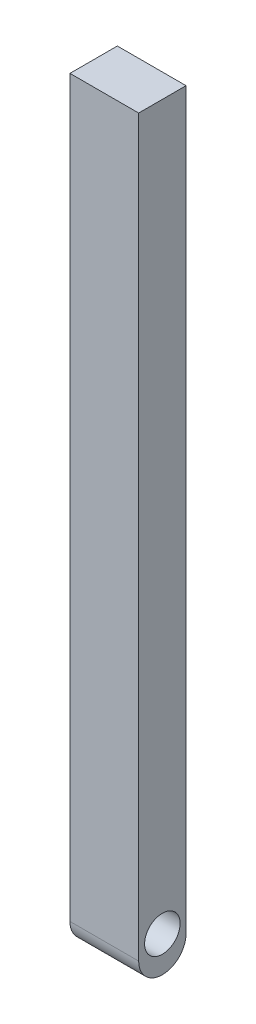
ISO-10303-21;
HEADER;
FILE_DESCRIPTION(('STEP AP214'),'2;1');
FILE_NAME('part.step','',(''),(''),'','','');
FILE_SCHEMA(('AUTOMOTIVE_DESIGN { 1 0 10303 214 1 1 1 1 }'));
ENDSEC;
DATA;
#1=APPLICATION_CONTEXT('core data for automotive mechanical design processes');
#2=APPLICATION_PROTOCOL_DEFINITION('international standard','automotive_design',2000,#1);
#3=PRODUCT_CONTEXT('',#1,'mechanical');
#4=PRODUCT('Part','Part','',(#3));
#5=PRODUCT_RELATED_PRODUCT_CATEGORY('part','',(#4));
#6=PRODUCT_DEFINITION_FORMATION('','',#4);
#7=PRODUCT_DEFINITION_CONTEXT('part definition',#1,'design');
#8=PRODUCT_DEFINITION('design','',#6,#7);
#9=PRODUCT_DEFINITION_SHAPE('','',#8);
#10=(LENGTH_UNIT() NAMED_UNIT(*) SI_UNIT(.MILLI.,.METRE.));
#11=(NAMED_UNIT(*) PLANE_ANGLE_UNIT() SI_UNIT($,.RADIAN.));
#12=(NAMED_UNIT(*) SI_UNIT($,.STERADIAN.) SOLID_ANGLE_UNIT());
#13=UNCERTAINTY_MEASURE_WITH_UNIT(LENGTH_MEASURE(1.E-05),#10,'distance_accuracy_value','');
#14=(GEOMETRIC_REPRESENTATION_CONTEXT(3) GLOBAL_UNCERTAINTY_ASSIGNED_CONTEXT((#13)) GLOBAL_UNIT_ASSIGNED_CONTEXT((#10,
#11,#12)) REPRESENTATION_CONTEXT('',''));
#15=CARTESIAN_POINT('',(0.,0.,0.));
#16=DIRECTION('',(0.,0.,1.));
#17=DIRECTION('',(1.,0.,0.));
#18=AXIS2_PLACEMENT_3D('',#15,#16,#17);
#19=CARTESIAN_POINT('',(-2.13821554228844,10.1768104776579,2.));
#20=DIRECTION('',(1.,0.,0.));
#21=DIRECTION('',(0.,1.,0.));
#22=AXIS2_PLACEMENT_3D('',#19,#20,#21);
#23=PLANE('',#22);
#24=CARTESIAN_POINT('',(-2.13821554228843,-20.3231895223421,1.));
#25=DIRECTION('',(1.,0.,0.));
#26=DIRECTION('',(0.,1.,0.));
#27=AXIS2_PLACEMENT_3D('',#24,#25,#26);
#28=CIRCLE('',#27,0.750000000000001);
#29=CARTESIAN_POINT('',(-2.13821554228843,-19.5731895223421,1.));
#30=VERTEX_POINT('',#29);
#31=EDGE_CURVE('E124',#30,#30,#28,.T.);
#32=ORIENTED_EDGE('',*,*,#31,.T.);
#33=EDGE_LOOP('',(#32));
#34=FACE_BOUND('',#33,.T.);
#35=CARTESIAN_POINT('',(-2.13821554228843,-20.8231895223421,1.));
#36=DIRECTION('',(1.,0.,0.));
#37=DIRECTION('',(0.,1.,0.));
#38=AXIS2_PLACEMENT_3D('',#35,#36,#37);
#39=CIRCLE('',#38,1.);
#40=CARTESIAN_POINT('',(-2.13821554228843,-20.8231895223421,0.));
#41=VERTEX_POINT('',#40);
#42=CARTESIAN_POINT('',(-2.13821554228843,-21.8231895223421,1.));
#43=VERTEX_POINT('',#42);
#44=EDGE_CURVE('E48',#41,#43,#39,.F.);
#45=ORIENTED_EDGE('',*,*,#44,.T.);
#46=CARTESIAN_POINT('',(-2.13821554228843,-20.8231895223421,1.));
#47=DIRECTION('',(1.,0.,0.));
#48=DIRECTION('',(0.,1.,0.));
#49=AXIS2_PLACEMENT_3D('',#46,#47,#48);
#50=CIRCLE('',#49,1.);
#51=CARTESIAN_POINT('',(-2.13821554228843,-20.8231895223421,2.));
#52=VERTEX_POINT('',#51);
#53=EDGE_CURVE('E41',#43,#52,#50,.F.);
#54=ORIENTED_EDGE('',*,*,#53,.T.);
#55=DIRECTION('',(0.,-1.,0.));
#56=VECTOR('',#55,1.);
#57=CARTESIAN_POINT('',(-2.13821554228844,10.1768104776579,2.));
#58=LINE('',#57,#56);
#59=CARTESIAN_POINT('',(-2.13821554228844,10.1768104776579,2.));
#60=VERTEX_POINT('',#59);
#61=EDGE_CURVE('E90',#60,#52,#58,.T.);
#62=ORIENTED_EDGE('',*,*,#61,.F.);
#63=DIRECTION('',(0.,0.,-1.));
#64=VECTOR('',#63,1.);
#65=CARTESIAN_POINT('',(-2.13821554228844,10.1768104776579,2.));
#66=LINE('',#65,#64);
#67=CARTESIAN_POINT('',(-2.13821554228844,10.1768104776579,0.));
#68=VERTEX_POINT('',#67);
#69=EDGE_CURVE('E98',#60,#68,#66,.T.);
#70=ORIENTED_EDGE('',*,*,#69,.T.);
#71=DIRECTION('',(0.,-1.,0.));
#72=VECTOR('',#71,1.);
#73=CARTESIAN_POINT('',(-2.13821554228844,10.1768104776579,0.));
#74=LINE('',#73,#72);
#75=EDGE_CURVE('E107',#68,#41,#74,.T.);
#76=ORIENTED_EDGE('',*,*,#75,.T.);
#77=EDGE_LOOP('',(#45,#54,#62,#70,#76));
#78=FACE_BOUND('',#77,.T.);
#79=ADVANCED_FACE('F32',(#34,#78),#23,.F.);
#80=CARTESIAN_POINT('',(0.761784457711564,10.1768104776579,2.));
#81=DIRECTION('',(-1.,0.,0.));
#82=DIRECTION('',(0.,-1.,0.));
#83=AXIS2_PLACEMENT_3D('',#80,#81,#82);
#84=PLANE('',#83);
#85=CARTESIAN_POINT('',(0.761784457711566,-20.3231895223421,1.));
#86=DIRECTION('',(1.,0.,0.));
#87=DIRECTION('',(0.,1.,0.));
#88=AXIS2_PLACEMENT_3D('',#85,#86,#87);
#89=CIRCLE('',#88,0.750000000000001);
#90=CARTESIAN_POINT('',(0.761784457711566,-19.5731895223421,1.));
#91=VERTEX_POINT('',#90);
#92=EDGE_CURVE('E126',#91,#91,#89,.T.);
#93=ORIENTED_EDGE('',*,*,#92,.F.);
#94=EDGE_LOOP('',(#93));
#95=FACE_BOUND('',#94,.T.);
#96=DIRECTION('',(0.,1.,0.));
#97=VECTOR('',#96,1.);
#98=CARTESIAN_POINT('',(0.761784457711564,10.1768104776579,2.));
#99=LINE('',#98,#97);
#100=CARTESIAN_POINT('',(0.761784457711566,-20.8231895223421,2.));
#101=VERTEX_POINT('',#100);
#102=CARTESIAN_POINT('',(0.761784457711564,10.1768104776579,2.));
#103=VERTEX_POINT('',#102);
#104=EDGE_CURVE('E80',#101,#103,#99,.T.);
#105=ORIENTED_EDGE('',*,*,#104,.F.);
#106=CARTESIAN_POINT('',(0.761784457711566,-20.8231895223421,1.));
#107=DIRECTION('',(-1.,0.,0.));
#108=DIRECTION('',(0.,-1.,0.));
#109=AXIS2_PLACEMENT_3D('',#106,#107,#108);
#110=CIRCLE('',#109,1.);
#111=CARTESIAN_POINT('',(0.761784457711566,-21.8231895223421,1.));
#112=VERTEX_POINT('',#111);
#113=EDGE_CURVE('E115',#101,#112,#110,.F.);
#114=ORIENTED_EDGE('',*,*,#113,.T.);
#115=CARTESIAN_POINT('',(0.761784457711566,-20.8231895223421,1.));
#116=DIRECTION('',(-1.,0.,0.));
#117=DIRECTION('',(0.,-1.,0.));
#118=AXIS2_PLACEMENT_3D('',#115,#116,#117);
#119=CIRCLE('',#118,1.);
#120=CARTESIAN_POINT('',(0.761784457711566,-20.8231895223421,0.));
#121=VERTEX_POINT('',#120);
#122=EDGE_CURVE('E113',#112,#121,#119,.F.);
#123=ORIENTED_EDGE('',*,*,#122,.T.);
#124=DIRECTION('',(0.,1.,0.));
#125=VECTOR('',#124,1.);
#126=CARTESIAN_POINT('',(0.761784457711564,10.1768104776579,0.));
#127=LINE('',#126,#125);
#128=CARTESIAN_POINT('',(0.761784457711564,10.1768104776579,0.));
#129=VERTEX_POINT('',#128);
#130=EDGE_CURVE('E95',#121,#129,#127,.T.);
#131=ORIENTED_EDGE('',*,*,#130,.T.);
#132=DIRECTION('',(0.,0.,-1.));
#133=VECTOR('',#132,1.);
#134=CARTESIAN_POINT('',(0.761784457711564,10.1768104776579,2.));
#135=LINE('',#134,#133);
#136=EDGE_CURVE('E93',#103,#129,#135,.T.);
#137=ORIENTED_EDGE('',*,*,#136,.F.);
#138=EDGE_LOOP('',(#105,#114,#123,#131,#137));
#139=FACE_BOUND('',#138,.T.);
#140=ADVANCED_FACE('F94',(#95,#139),#84,.F.);
#141=CARTESIAN_POINT('',(-2.13821554228844,10.1768104776579,2.));
#142=DIRECTION('',(0.,-1.,0.));
#143=DIRECTION('',(0.,0.,-1.));
#144=AXIS2_PLACEMENT_3D('',#141,#142,#143);
#145=PLANE('',#144);
#146=DIRECTION('',(-1.,0.,0.));
#147=VECTOR('',#146,1.);
#148=CARTESIAN_POINT('',(-2.13821554228844,10.1768104776579,0.));
#149=LINE('',#148,#147);
#150=EDGE_CURVE('E110',#129,#68,#149,.T.);
#151=ORIENTED_EDGE('',*,*,#150,.T.);
#152=ORIENTED_EDGE('',*,*,#69,.F.);
#153=DIRECTION('',(-1.,0.,0.));
#154=VECTOR('',#153,1.);
#155=CARTESIAN_POINT('',(-2.13821554228844,10.1768104776579,2.));
#156=LINE('',#155,#154);
#157=EDGE_CURVE('E85',#103,#60,#156,.T.);
#158=ORIENTED_EDGE('',*,*,#157,.F.);
#159=ORIENTED_EDGE('',*,*,#136,.T.);
#160=EDGE_LOOP('',(#151,#152,#158,#159));
#161=FACE_BOUND('',#160,.T.);
#162=ADVANCED_FACE('F100',(#161),#145,.F.);
#163=CARTESIAN_POINT('',(0.,0.,2.));
#164=DIRECTION('',(0.,0.,1.));
#165=DIRECTION('',(1.,0.,0.));
#166=AXIS2_PLACEMENT_3D('',#163,#164,#165);
#167=PLANE('',#166);
#168=ORIENTED_EDGE('',*,*,#61,.T.);
#169=DIRECTION('',(1.,0.,0.));
#170=VECTOR('',#169,1.);
#171=CARTESIAN_POINT('',(0.761784457711566,-20.8231895223421,2.));
#172=LINE('',#171,#170);
#173=EDGE_CURVE('E88',#52,#101,#172,.T.);
#174=ORIENTED_EDGE('',*,*,#173,.T.);
#175=ORIENTED_EDGE('',*,*,#104,.T.);
#176=ORIENTED_EDGE('',*,*,#157,.T.);
#177=EDGE_LOOP('',(#168,#174,#175,#176));
#178=FACE_BOUND('',#177,.T.);
#179=ADVANCED_FACE('F83',(#178),#167,.T.);
#180=CARTESIAN_POINT('',(0.,0.,0.));
#181=DIRECTION('',(0.,0.,1.));
#182=DIRECTION('',(1.,0.,0.));
#183=AXIS2_PLACEMENT_3D('',#180,#181,#182);
#184=PLANE('',#183);
#185=ORIENTED_EDGE('',*,*,#130,.F.);
#186=DIRECTION('',(1.,0.,0.));
#187=VECTOR('',#186,1.);
#188=CARTESIAN_POINT('',(0.,-20.8231895223421,0.));
#189=LINE('',#188,#187);
#190=EDGE_CURVE('E11',#121,#41,#189,.F.);
#191=ORIENTED_EDGE('',*,*,#190,.T.);
#192=ORIENTED_EDGE('',*,*,#75,.F.);
#193=ORIENTED_EDGE('',*,*,#150,.F.);
#194=EDGE_LOOP('',(#185,#191,#192,#193));
#195=FACE_BOUND('',#194,.T.);
#196=ADVANCED_FACE('F152',(#195),#184,.F.);
#197=CARTESIAN_POINT('',(-2.13821554228843,-20.8231895223421,1.));
#198=DIRECTION('',(1.,0.,0.));
#199=DIRECTION('',(0.,0.,-1.));
#200=AXIS2_PLACEMENT_3D('',#197,#198,#199);
#201=CYLINDRICAL_SURFACE('',#200,1.);
#202=DIRECTION('',(1.,0.,0.));
#203=VECTOR('',#202,1.);
#204=CARTESIAN_POINT('',(-2.13821554228843,-21.8231895223421,1.));
#205=LINE('',#204,#203);
#206=EDGE_CURVE('E36',#43,#112,#205,.T.);
#207=ORIENTED_EDGE('',*,*,#206,.F.);
#208=ORIENTED_EDGE('',*,*,#44,.F.);
#209=ORIENTED_EDGE('',*,*,#190,.F.);
#210=ORIENTED_EDGE('',*,*,#122,.F.);
#211=EDGE_LOOP('',(#207,#208,#209,#210));
#212=FACE_BOUND('',#211,.T.);
#213=ADVANCED_FACE('F34',(#212),#201,.T.);
#214=CARTESIAN_POINT('',(0.,-20.8231895223421,1.));
#215=DIRECTION('',(-1.,0.,0.));
#216=DIRECTION('',(0.,0.,1.));
#217=AXIS2_PLACEMENT_3D('',#214,#215,#216);
#218=CYLINDRICAL_SURFACE('',#217,1.);
#219=ORIENTED_EDGE('',*,*,#53,.F.);
#220=ORIENTED_EDGE('',*,*,#206,.T.);
#221=ORIENTED_EDGE('',*,*,#113,.F.);
#222=ORIENTED_EDGE('',*,*,#173,.F.);
#223=EDGE_LOOP('',(#219,#220,#221,#222));
#224=FACE_BOUND('',#223,.T.);
#225=ADVANCED_FACE('F121',(#224),#218,.T.);
#226=CARTESIAN_POINT('',(-2.23821554228843,-20.3231895223421,1.));
#227=DIRECTION('',(1.,0.,0.));
#228=DIRECTION('',(0.,1.,0.));
#229=AXIS2_PLACEMENT_3D('',#226,#227,#228);
#230=CYLINDRICAL_SURFACE('',#229,0.750000000000001);
#231=ORIENTED_EDGE('',*,*,#92,.T.);
#232=EDGE_LOOP('',(#231));
#233=FACE_BOUND('',#232,.T.);
#234=ORIENTED_EDGE('',*,*,#31,.F.);
#235=EDGE_LOOP('',(#234));
#236=FACE_BOUND('',#235,.T.);
#237=ADVANCED_FACE('F134',(#233,#236),#230,.F.);
#238=CLOSED_SHELL('',(#79,#140,#162,#179,#196,#213,#225,#237));
#239=MANIFOLD_SOLID_BREP('B2',#238);
#240=ADVANCED_BREP_SHAPE_REPRESENTATION('',(#18,#239),#14);
#241=SHAPE_DEFINITION_REPRESENTATION(#9,#240);
ENDSEC;
END-ISO-10303-21;
